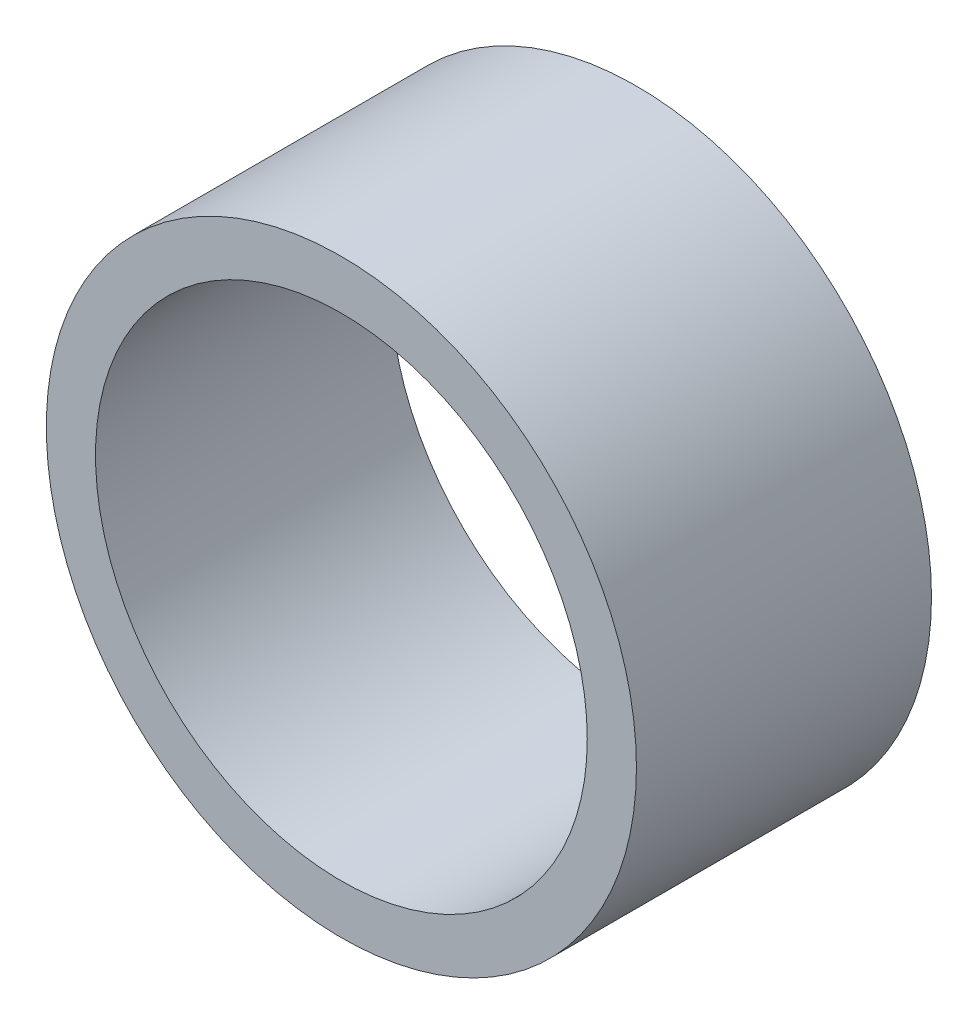
ISO-10303-21;
HEADER;
FILE_DESCRIPTION(('STEP AP214'),'2;1');
FILE_NAME('part.step','',(''),(''),'','','');
FILE_SCHEMA(('AUTOMOTIVE_DESIGN { 1 0 10303 214 1 1 1 1 }'));
ENDSEC;
DATA;
#1=APPLICATION_CONTEXT('core data for automotive mechanical design processes');
#2=APPLICATION_PROTOCOL_DEFINITION('international standard','automotive_design',2000,#1);
#3=PRODUCT_CONTEXT('',#1,'mechanical');
#4=PRODUCT('Part','Part','',(#3));
#5=PRODUCT_RELATED_PRODUCT_CATEGORY('part','',(#4));
#6=PRODUCT_DEFINITION_FORMATION('','',#4);
#7=PRODUCT_DEFINITION_CONTEXT('part definition',#1,'design');
#8=PRODUCT_DEFINITION('design','',#6,#7);
#9=PRODUCT_DEFINITION_SHAPE('','',#8);
#10=(LENGTH_UNIT() NAMED_UNIT(*) SI_UNIT(.MILLI.,.METRE.));
#11=(NAMED_UNIT(*) PLANE_ANGLE_UNIT() SI_UNIT($,.RADIAN.));
#12=(NAMED_UNIT(*) SI_UNIT($,.STERADIAN.) SOLID_ANGLE_UNIT());
#13=UNCERTAINTY_MEASURE_WITH_UNIT(LENGTH_MEASURE(1.E-05),#10,'distance_accuracy_value','');
#14=(GEOMETRIC_REPRESENTATION_CONTEXT(3) GLOBAL_UNCERTAINTY_ASSIGNED_CONTEXT((#13)) GLOBAL_UNIT_ASSIGNED_CONTEXT((#10,
#11,#12)) REPRESENTATION_CONTEXT('',''));
#15=CARTESIAN_POINT('',(0.,0.,0.));
#16=DIRECTION('',(0.,0.,1.));
#17=DIRECTION('',(1.,0.,0.));
#18=AXIS2_PLACEMENT_3D('',#15,#16,#17);
#19=CARTESIAN_POINT('',(0.,0.,6.));
#20=DIRECTION('',(0.,0.,1.));
#21=DIRECTION('',(1.,0.,0.));
#22=AXIS2_PLACEMENT_3D('',#19,#20,#21);
#23=PLANE('',#22);
#24=CARTESIAN_POINT('',(0.,0.,6.));
#25=DIRECTION('',(0.,0.,1.));
#26=DIRECTION('',(1.,0.,0.));
#27=AXIS2_PLACEMENT_3D('',#24,#25,#26);
#28=CIRCLE('',#27,6.);
#29=CARTESIAN_POINT('',(6.,0.,6.));
#30=VERTEX_POINT('',#29);
#31=EDGE_CURVE('E11',#30,#30,#28,.T.);
#32=ORIENTED_EDGE('',*,*,#31,.T.);
#33=EDGE_LOOP('',(#32));
#34=FACE_BOUND('',#33,.T.);
#35=CARTESIAN_POINT('',(0.,0.,6.));
#36=DIRECTION('',(0.,0.,1.));
#37=DIRECTION('',(1.,0.,0.));
#38=AXIS2_PLACEMENT_3D('',#35,#36,#37);
#39=CIRCLE('',#38,5.);
#40=CARTESIAN_POINT('',(5.,0.,6.));
#41=VERTEX_POINT('',#40);
#42=EDGE_CURVE('E54',#41,#41,#39,.T.);
#43=ORIENTED_EDGE('',*,*,#42,.F.);
#44=EDGE_LOOP('',(#43));
#45=FACE_BOUND('',#44,.T.);
#46=ADVANCED_FACE('F43',(#34,#45),#23,.T.);
#47=CARTESIAN_POINT('',(0.,0.,0.));
#48=DIRECTION('',(0.,0.,1.));
#49=DIRECTION('',(1.,0.,0.));
#50=AXIS2_PLACEMENT_3D('',#47,#48,#49);
#51=PLANE('',#50);
#52=CARTESIAN_POINT('',(0.,0.,0.));
#53=DIRECTION('',(0.,0.,1.));
#54=DIRECTION('',(1.,0.,0.));
#55=AXIS2_PLACEMENT_3D('',#52,#53,#54);
#56=CIRCLE('',#55,6.);
#57=CARTESIAN_POINT('',(6.,0.,0.));
#58=VERTEX_POINT('',#57);
#59=EDGE_CURVE('E47',#58,#58,#56,.T.);
#60=ORIENTED_EDGE('',*,*,#59,.F.);
#61=EDGE_LOOP('',(#60));
#62=FACE_BOUND('',#61,.T.);
#63=CARTESIAN_POINT('',(0.,0.,0.));
#64=DIRECTION('',(0.,0.,1.));
#65=DIRECTION('',(1.,0.,0.));
#66=AXIS2_PLACEMENT_3D('',#63,#64,#65);
#67=CIRCLE('',#66,5.);
#68=CARTESIAN_POINT('',(5.,0.,0.));
#69=VERTEX_POINT('',#68);
#70=EDGE_CURVE('E56',#69,#69,#67,.T.);
#71=ORIENTED_EDGE('',*,*,#70,.T.);
#72=EDGE_LOOP('',(#71));
#73=FACE_BOUND('',#72,.T.);
#74=ADVANCED_FACE('F66',(#62,#73),#51,.F.);
#75=CARTESIAN_POINT('',(0.,0.,6.));
#76=DIRECTION('',(0.,0.,-1.));
#77=DIRECTION('',(-1.,0.,0.));
#78=AXIS2_PLACEMENT_3D('',#75,#76,#77);
#79=CYLINDRICAL_SURFACE('',#78,6.);
#80=ORIENTED_EDGE('',*,*,#31,.F.);
#81=EDGE_LOOP('',(#80));
#82=FACE_BOUND('',#81,.T.);
#83=ORIENTED_EDGE('',*,*,#59,.T.);
#84=EDGE_LOOP('',(#83));
#85=FACE_BOUND('',#84,.T.);
#86=ADVANCED_FACE('F45',(#82,#85),#79,.T.);
#87=CARTESIAN_POINT('',(0.,0.,6.));
#88=DIRECTION('',(0.,0.,-1.));
#89=DIRECTION('',(-1.,0.,0.));
#90=AXIS2_PLACEMENT_3D('',#87,#88,#89);
#91=CYLINDRICAL_SURFACE('',#90,5.);
#92=ORIENTED_EDGE('',*,*,#42,.T.);
#93=EDGE_LOOP('',(#92));
#94=FACE_BOUND('',#93,.T.);
#95=ORIENTED_EDGE('',*,*,#70,.F.);
#96=EDGE_LOOP('',(#95));
#97=FACE_BOUND('',#96,.T.);
#98=ADVANCED_FACE('F62',(#94,#97),#91,.F.);
#99=CLOSED_SHELL('',(#46,#74,#86,#98));
#100=MANIFOLD_SOLID_BREP('B2',#99);
#101=ADVANCED_BREP_SHAPE_REPRESENTATION('',(#18,#100),#14);
#102=SHAPE_DEFINITION_REPRESENTATION(#9,#101);
ENDSEC;
END-ISO-10303-21;
